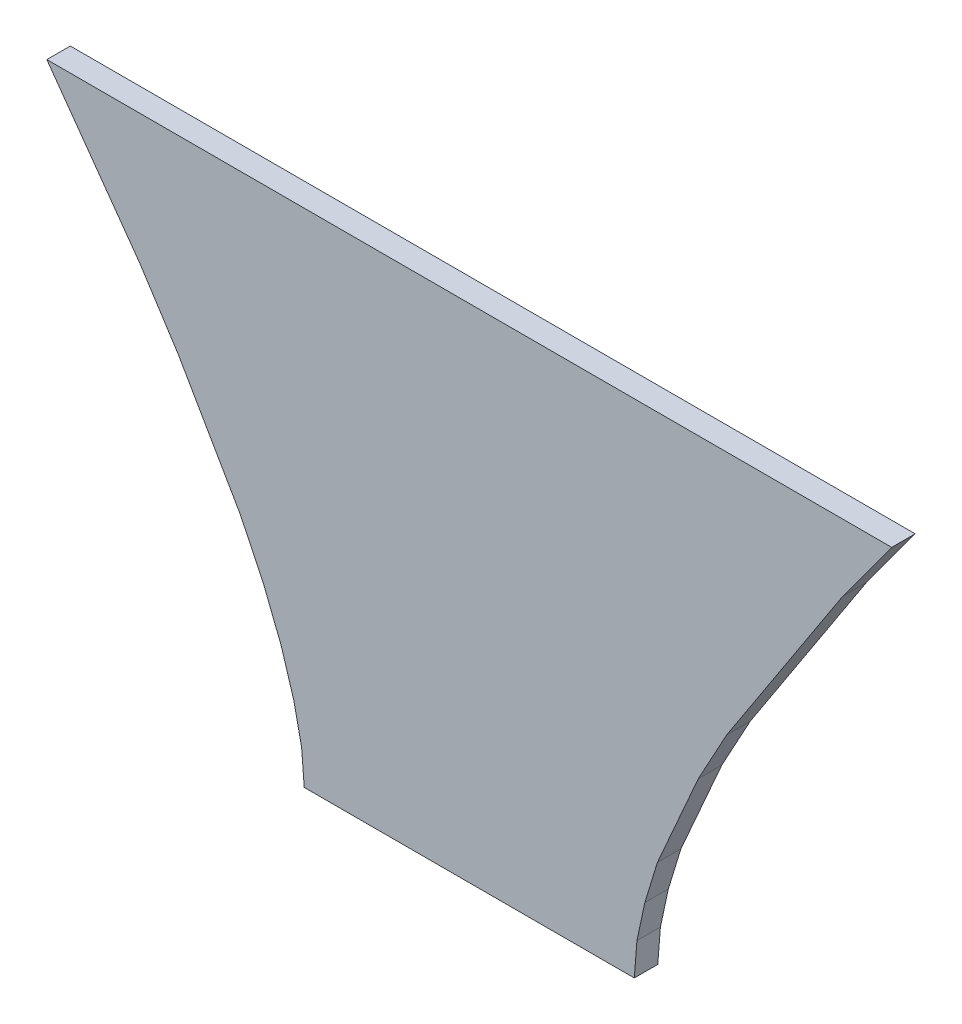
ISO-10303-21;
HEADER;
FILE_DESCRIPTION(('STEP AP214'),'2;1');
FILE_NAME('part.step','',(''),(''),'','','');
FILE_SCHEMA(('AUTOMOTIVE_DESIGN { 1 0 10303 214 1 1 1 1 }'));
ENDSEC;
DATA;
#1=APPLICATION_CONTEXT('core data for automotive mechanical design processes');
#2=APPLICATION_PROTOCOL_DEFINITION('international standard','automotive_design',2000,#1);
#3=PRODUCT_CONTEXT('',#1,'mechanical');
#4=PRODUCT('Part','Part','',(#3));
#5=PRODUCT_RELATED_PRODUCT_CATEGORY('part','',(#4));
#6=PRODUCT_DEFINITION_FORMATION('','',#4);
#7=PRODUCT_DEFINITION_CONTEXT('part definition',#1,'design');
#8=PRODUCT_DEFINITION('design','',#6,#7);
#9=PRODUCT_DEFINITION_SHAPE('','',#8);
#10=(LENGTH_UNIT() NAMED_UNIT(*) SI_UNIT(.MILLI.,.METRE.));
#11=(NAMED_UNIT(*) PLANE_ANGLE_UNIT() SI_UNIT($,.RADIAN.));
#12=(NAMED_UNIT(*) SI_UNIT($,.STERADIAN.) SOLID_ANGLE_UNIT());
#13=UNCERTAINTY_MEASURE_WITH_UNIT(LENGTH_MEASURE(1.E-05),#10,'distance_accuracy_value','');
#14=(GEOMETRIC_REPRESENTATION_CONTEXT(3) GLOBAL_UNCERTAINTY_ASSIGNED_CONTEXT((#13)) GLOBAL_UNIT_ASSIGNED_CONTEXT((#10,
#11,#12)) REPRESENTATION_CONTEXT('',''));
#15=CARTESIAN_POINT('',(0.,0.,0.));
#16=DIRECTION('',(0.,0.,1.));
#17=DIRECTION('',(1.,0.,0.));
#18=AXIS2_PLACEMENT_3D('',#15,#16,#17);
#19=CARTESIAN_POINT('',(44.3499984741211,57.3600006103516,0.));
#20=DIRECTION('',(-0.996935755737202,0.0782246695914672,0.));
#21=DIRECTION('',(0.0782246695914672,0.996935755737202,0.));
#22=AXIS2_PLACEMENT_3D('',#19,#20,#21);
#23=PLANE('',#22);
#24=DIRECTION('',(0.0782246695914672,0.996935755737202,0.));
#25=VECTOR('',#24,1.);
#26=CARTESIAN_POINT('',(44.3499984741211,57.3600006103516,0.03556));
#27=LINE('',#26,#25);
#28=CARTESIAN_POINT('',(44.3499984741211,57.3600006103516,0.03556));
#29=VERTEX_POINT('',#28);
#30=CARTESIAN_POINT('',(44.3540000915527,57.4109992980957,0.03556));
#31=VERTEX_POINT('',#30);
#32=EDGE_CURVE('E11',#29,#31,#27,.T.);
#33=ORIENTED_EDGE('',*,*,#32,.F.);
#34=DIRECTION('',(0.,0.,1.));
#35=VECTOR('',#34,1.);
#36=CARTESIAN_POINT('',(44.3499984741211,57.3600006103516,0.));
#37=LINE('',#36,#35);
#38=CARTESIAN_POINT('',(44.3499984741211,57.3600006103516,0.));
#39=VERTEX_POINT('',#38);
#40=EDGE_CURVE('E24',#39,#29,#37,.T.);
#41=ORIENTED_EDGE('',*,*,#40,.F.);
#42=DIRECTION('',(0.0782246695914672,0.996935755737202,0.));
#43=VECTOR('',#42,1.);
#44=CARTESIAN_POINT('',(44.3499984741211,57.3600006103516,0.));
#45=LINE('',#44,#43);
#46=CARTESIAN_POINT('',(44.3540000915527,57.4109992980957,0.));
#47=VERTEX_POINT('',#46);
#48=EDGE_CURVE('E154',#39,#47,#45,.T.);
#49=ORIENTED_EDGE('',*,*,#48,.T.);
#50=DIRECTION('',(0.,0.,1.));
#51=VECTOR('',#50,1.);
#52=CARTESIAN_POINT('',(44.3540000915527,57.4109992980957,0.));
#53=LINE('',#52,#51);
#54=EDGE_CURVE('E37',#47,#31,#53,.T.);
#55=ORIENTED_EDGE('',*,*,#54,.T.);
#56=EDGE_LOOP('',(#33,#41,#49,#55));
#57=FACE_BOUND('',#56,.T.);
#58=ADVANCED_FACE('F17',(#57),#23,.F.);
#59=CARTESIAN_POINT('',(44.3540000915527,57.4109992980957,0.));
#60=DIRECTION('',(-0.977798514930854,0.20954728392183,0.));
#61=DIRECTION('',(0.20954728392183,0.977798514930854,0.));
#62=AXIS2_PLACEMENT_3D('',#59,#60,#61);
#63=PLANE('',#62);
#64=DIRECTION('',(0.20954728392183,0.977798514930854,0.));
#65=VECTOR('',#64,1.);
#66=CARTESIAN_POINT('',(44.3540000915527,57.4109992980957,0.03556));
#67=LINE('',#66,#65);
#68=CARTESIAN_POINT('',(44.3660011291504,57.4669990539551,0.03556));
#69=VERTEX_POINT('',#68);
#70=EDGE_CURVE('E266',#31,#69,#67,.T.);
#71=ORIENTED_EDGE('',*,*,#70,.F.);
#72=ORIENTED_EDGE('',*,*,#54,.F.);
#73=DIRECTION('',(0.20954728392183,0.977798514930854,0.));
#74=VECTOR('',#73,1.);
#75=CARTESIAN_POINT('',(44.3540000915527,57.4109992980957,0.));
#76=LINE('',#75,#74);
#77=CARTESIAN_POINT('',(44.3660011291504,57.4669990539551,0.));
#78=VERTEX_POINT('',#77);
#79=EDGE_CURVE('E263',#47,#78,#76,.T.);
#80=ORIENTED_EDGE('',*,*,#79,.T.);
#81=DIRECTION('',(0.,0.,1.));
#82=VECTOR('',#81,1.);
#83=CARTESIAN_POINT('',(44.3660011291504,57.4669990539551,0.));
#84=LINE('',#83,#82);
#85=EDGE_CURVE('E261',#78,#69,#84,.T.);
#86=ORIENTED_EDGE('',*,*,#85,.T.);
#87=EDGE_LOOP('',(#71,#72,#80,#86));
#88=FACE_BOUND('',#87,.T.);
#89=ADVANCED_FACE('F274',(#88),#63,.F.);
#90=CARTESIAN_POINT('',(44.3660011291504,57.4669990539551,0.));
#91=DIRECTION('',(-0.956124316979851,0.292961243989396,0.));
#92=DIRECTION('',(0.292961243989396,0.956124316979851,0.));
#93=AXIS2_PLACEMENT_3D('',#90,#91,#92);
#94=PLANE('',#93);
#95=DIRECTION('',(0.292961243989396,0.956124316979851,0.));
#96=VECTOR('',#95,1.);
#97=CARTESIAN_POINT('',(44.3660011291504,57.4669990539551,0.03556));
#98=LINE('',#97,#96);
#99=CARTESIAN_POINT('',(44.3849983215332,57.5289993286133,0.03556));
#100=VERTEX_POINT('',#99);
#101=EDGE_CURVE('E258',#69,#100,#98,.T.);
#102=ORIENTED_EDGE('',*,*,#101,.F.);
#103=ORIENTED_EDGE('',*,*,#85,.F.);
#104=DIRECTION('',(0.292961243989396,0.956124316979851,0.));
#105=VECTOR('',#104,1.);
#106=CARTESIAN_POINT('',(44.3660011291504,57.4669990539551,0.));
#107=LINE('',#106,#105);
#108=CARTESIAN_POINT('',(44.3849983215332,57.5289993286133,0.));
#109=VERTEX_POINT('',#108);
#110=EDGE_CURVE('E255',#78,#109,#107,.T.);
#111=ORIENTED_EDGE('',*,*,#110,.T.);
#112=DIRECTION('',(0.,0.,1.));
#113=VECTOR('',#112,1.);
#114=CARTESIAN_POINT('',(44.3849983215332,57.5289993286133,0.));
#115=LINE('',#114,#113);
#116=EDGE_CURVE('E253',#109,#100,#115,.T.);
#117=ORIENTED_EDGE('',*,*,#116,.T.);
#118=EDGE_LOOP('',(#102,#103,#111,#117));
#119=FACE_BOUND('',#118,.T.);
#120=ADVANCED_FACE('F280',(#119),#94,.F.);
#121=CARTESIAN_POINT('',(44.3849983215332,57.5289993286133,0.));
#122=DIRECTION('',(-0.915408860238773,0.402525301808906,0.));
#123=DIRECTION('',(0.402525301808906,0.915408860238773,0.));
#124=AXIS2_PLACEMENT_3D('',#121,#122,#123);
#125=PLANE('',#124);
#126=DIRECTION('',(0.402525301808906,0.915408860238773,0.));
#127=VECTOR('',#126,1.);
#128=CARTESIAN_POINT('',(44.3849983215332,57.5289993286133,0.03556));
#129=LINE('',#128,#127);
#130=CARTESIAN_POINT('',(44.4469985961914,57.6699981689453,0.03556));
#131=VERTEX_POINT('',#130);
#132=EDGE_CURVE('E250',#100,#131,#129,.T.);
#133=ORIENTED_EDGE('',*,*,#132,.F.);
#134=ORIENTED_EDGE('',*,*,#116,.F.);
#135=DIRECTION('',(0.402525301808906,0.915408860238773,0.));
#136=VECTOR('',#135,1.);
#137=CARTESIAN_POINT('',(44.3849983215332,57.5289993286133,0.));
#138=LINE('',#137,#136);
#139=CARTESIAN_POINT('',(44.4469985961914,57.6699981689453,0.));
#140=VERTEX_POINT('',#139);
#141=EDGE_CURVE('E247',#109,#140,#138,.T.);
#142=ORIENTED_EDGE('',*,*,#141,.T.);
#143=DIRECTION('',(0.,0.,1.));
#144=VECTOR('',#143,1.);
#145=CARTESIAN_POINT('',(44.4469985961914,57.6699981689453,0.));
#146=LINE('',#145,#144);
#147=EDGE_CURVE('E245',#140,#131,#146,.T.);
#148=ORIENTED_EDGE('',*,*,#147,.T.);
#149=EDGE_LOOP('',(#133,#134,#142,#148));
#150=FACE_BOUND('',#149,.T.);
#151=ADVANCED_FACE('F282',(#150),#125,.F.);
#152=CARTESIAN_POINT('',(44.4469985961914,57.6699981689453,0.));
#153=DIRECTION('',(-0.878311777532208,0.478088298798676,0.));
#154=DIRECTION('',(0.478088298798676,0.878311777532208,0.));
#155=AXIS2_PLACEMENT_3D('',#152,#153,#154);
#156=PLANE('',#155);
#157=DIRECTION('',(0.478088298798676,0.878311777532208,0.));
#158=VECTOR('',#157,1.);
#159=CARTESIAN_POINT('',(44.4469985961914,57.6699981689453,0.03556));
#160=LINE('',#159,#158);
#161=CARTESIAN_POINT('',(44.4900016784668,57.7490005493164,0.03556));
#162=VERTEX_POINT('',#161);
#163=EDGE_CURVE('E242',#131,#162,#160,.T.);
#164=ORIENTED_EDGE('',*,*,#163,.F.);
#165=ORIENTED_EDGE('',*,*,#147,.F.);
#166=DIRECTION('',(0.478088298798676,0.878311777532208,0.));
#167=VECTOR('',#166,1.);
#168=CARTESIAN_POINT('',(44.4469985961914,57.6699981689453,0.));
#169=LINE('',#168,#167);
#170=CARTESIAN_POINT('',(44.4900016784668,57.7490005493164,0.));
#171=VERTEX_POINT('',#170);
#172=EDGE_CURVE('E239',#140,#171,#169,.T.);
#173=ORIENTED_EDGE('',*,*,#172,.T.);
#174=DIRECTION('',(0.,0.,1.));
#175=VECTOR('',#174,1.);
#176=CARTESIAN_POINT('',(44.4900016784668,57.7490005493164,0.));
#177=LINE('',#176,#175);
#178=EDGE_CURVE('E237',#171,#162,#177,.T.);
#179=ORIENTED_EDGE('',*,*,#178,.T.);
#180=EDGE_LOOP('',(#164,#165,#173,#179));
#181=FACE_BOUND('',#180,.T.);
#182=ADVANCED_FACE('F287',(#181),#156,.F.);
#183=CARTESIAN_POINT('',(44.4900016784668,57.7490005493164,0.));
#184=DIRECTION('',(-0.837736311937865,0.546074968901472,0.));
#185=DIRECTION('',(0.546074968901472,0.837736311937865,0.));
#186=AXIS2_PLACEMENT_3D('',#183,#184,#185);
#187=PLANE('',#186);
#188=DIRECTION('',(0.546074968901472,0.837736311937865,0.));
#189=VECTOR('',#188,1.);
#190=CARTESIAN_POINT('',(44.4900016784668,57.7490005493164,0.03556));
#191=LINE('',#190,#189);
#192=CARTESIAN_POINT('',(44.6660003662109,58.0190010070801,0.03556));
#193=VERTEX_POINT('',#192);
#194=EDGE_CURVE('E234',#162,#193,#191,.T.);
#195=ORIENTED_EDGE('',*,*,#194,.F.);
#196=ORIENTED_EDGE('',*,*,#178,.F.);
#197=DIRECTION('',(0.546074968901472,0.837736311937865,0.));
#198=VECTOR('',#197,1.);
#199=CARTESIAN_POINT('',(44.4900016784668,57.7490005493164,0.));
#200=LINE('',#199,#198);
#201=CARTESIAN_POINT('',(44.6660003662109,58.0190010070801,0.));
#202=VERTEX_POINT('',#201);
#203=EDGE_CURVE('E231',#171,#202,#200,.T.);
#204=ORIENTED_EDGE('',*,*,#203,.T.);
#205=DIRECTION('',(0.,0.,1.));
#206=VECTOR('',#205,1.);
#207=CARTESIAN_POINT('',(44.6660003662109,58.0190010070801,0.));
#208=LINE('',#207,#206);
#209=EDGE_CURVE('E229',#202,#193,#208,.T.);
#210=ORIENTED_EDGE('',*,*,#209,.T.);
#211=EDGE_LOOP('',(#195,#196,#204,#210));
#212=FACE_BOUND('',#211,.T.);
#213=ADVANCED_FACE('F290',(#212),#187,.F.);
#214=CARTESIAN_POINT('',(44.6660003662109,58.0190010070801,0.));
#215=DIRECTION('',(-0.806648048454726,0.591032085359316,0.));
#216=DIRECTION('',(0.591032085359316,0.806648048454726,0.));
#217=AXIS2_PLACEMENT_3D('',#214,#215,#216);
#218=PLANE('',#217);
#219=DIRECTION('',(0.591032085359316,0.806648048454726,0.));
#220=VECTOR('',#219,1.);
#221=CARTESIAN_POINT('',(44.6660003662109,58.0190010070801,0.03556));
#222=LINE('',#221,#220);
#223=CARTESIAN_POINT('',(44.7400016784668,58.1199989318848,0.03556));
#224=VERTEX_POINT('',#223);
#225=EDGE_CURVE('E226',#193,#224,#222,.T.);
#226=ORIENTED_EDGE('',*,*,#225,.F.);
#227=ORIENTED_EDGE('',*,*,#209,.F.);
#228=DIRECTION('',(0.591032085359316,0.806648048454726,0.));
#229=VECTOR('',#228,1.);
#230=CARTESIAN_POINT('',(44.6660003662109,58.0190010070801,0.));
#231=LINE('',#230,#229);
#232=CARTESIAN_POINT('',(44.7400016784668,58.1199989318848,0.));
#233=VERTEX_POINT('',#232);
#234=EDGE_CURVE('E223',#202,#233,#231,.T.);
#235=ORIENTED_EDGE('',*,*,#234,.T.);
#236=DIRECTION('',(0.,0.,1.));
#237=VECTOR('',#236,1.);
#238=CARTESIAN_POINT('',(44.7400016784668,58.1199989318848,0.));
#239=LINE('',#238,#237);
#240=EDGE_CURVE('E221',#233,#224,#239,.T.);
#241=ORIENTED_EDGE('',*,*,#240,.T.);
#242=EDGE_LOOP('',(#226,#227,#235,#241));
#243=FACE_BOUND('',#242,.T.);
#244=ADVANCED_FACE('F295',(#243),#218,.F.);
#245=CARTESIAN_POINT('',(44.7400016784668,58.1199989318848,0.));
#246=DIRECTION('',(0.,-1.,0.));
#247=DIRECTION('',(-1.,0.,0.));
#248=AXIS2_PLACEMENT_3D('',#245,#246,#247);
#249=PLANE('',#248);
#250=DIRECTION('',(-1.,0.,0.));
#251=VECTOR('',#250,1.);
#252=CARTESIAN_POINT('',(44.7400016784668,58.1199989318848,0.03556));
#253=LINE('',#252,#251);
#254=CARTESIAN_POINT('',(43.4599990844727,58.1199989318848,0.03556));
#255=VERTEX_POINT('',#254);
#256=EDGE_CURVE('E218',#224,#255,#253,.T.);
#257=ORIENTED_EDGE('',*,*,#256,.F.);
#258=ORIENTED_EDGE('',*,*,#240,.F.);
#259=DIRECTION('',(-1.,0.,0.));
#260=VECTOR('',#259,1.);
#261=CARTESIAN_POINT('',(44.7400016784668,58.1199989318848,0.));
#262=LINE('',#261,#260);
#263=CARTESIAN_POINT('',(43.4599990844727,58.1199989318848,0.));
#264=VERTEX_POINT('',#263);
#265=EDGE_CURVE('E215',#233,#264,#262,.T.);
#266=ORIENTED_EDGE('',*,*,#265,.T.);
#267=DIRECTION('',(0.,0.,1.));
#268=VECTOR('',#267,1.);
#269=CARTESIAN_POINT('',(43.4599990844727,58.1199989318848,0.));
#270=LINE('',#269,#268);
#271=EDGE_CURVE('E213',#264,#255,#270,.T.);
#272=ORIENTED_EDGE('',*,*,#271,.T.);
#273=EDGE_LOOP('',(#257,#258,#266,#272));
#274=FACE_BOUND('',#273,.T.);
#275=ADVANCED_FACE('F298',(#274),#249,.F.);
#276=CARTESIAN_POINT('',(43.4599990844727,58.1199989318848,0.));
#277=DIRECTION('',(0.813168136703764,0.582028849327702,0.));
#278=DIRECTION('',(0.582028849327702,-0.813168136703764,0.));
#279=AXIS2_PLACEMENT_3D('',#276,#277,#278);
#280=PLANE('',#279);
#281=DIRECTION('',(0.582028849327702,-0.813168136703763,0.));
#282=VECTOR('',#281,1.);
#283=CARTESIAN_POINT('',(43.4599990844727,58.1199989318848,0.03556));
#284=LINE('',#283,#282);
#285=CARTESIAN_POINT('',(43.601001739502,57.9230003356934,0.03556));
#286=VERTEX_POINT('',#285);
#287=EDGE_CURVE('E210',#255,#286,#284,.T.);
#288=ORIENTED_EDGE('',*,*,#287,.F.);
#289=ORIENTED_EDGE('',*,*,#271,.F.);
#290=DIRECTION('',(0.582028849327702,-0.813168136703763,0.));
#291=VECTOR('',#290,1.);
#292=CARTESIAN_POINT('',(43.4599990844727,58.1199989318848,0.));
#293=LINE('',#292,#291);
#294=CARTESIAN_POINT('',(43.601001739502,57.9230003356934,0.));
#295=VERTEX_POINT('',#294);
#296=EDGE_CURVE('E207',#264,#295,#293,.T.);
#297=ORIENTED_EDGE('',*,*,#296,.T.);
#298=DIRECTION('',(0.,0.,1.));
#299=VECTOR('',#298,1.);
#300=CARTESIAN_POINT('',(43.601001739502,57.9230003356934,0.));
#301=LINE('',#300,#299);
#302=EDGE_CURVE('E205',#295,#286,#301,.T.);
#303=ORIENTED_EDGE('',*,*,#302,.T.);
#304=EDGE_LOOP('',(#288,#289,#297,#303));
#305=FACE_BOUND('',#304,.T.);
#306=ADVANCED_FACE('F303',(#305),#280,.F.);
#307=CARTESIAN_POINT('',(43.601001739502,57.9230003356934,0.));
#308=DIRECTION('',(0.840577163694531,0.541691823710916,0.));
#309=DIRECTION('',(0.541691823710916,-0.840577163694531,0.));
#310=AXIS2_PLACEMENT_3D('',#307,#308,#309);
#311=PLANE('',#310);
#312=DIRECTION('',(0.541691823710916,-0.840577163694531,0.));
#313=VECTOR('',#312,1.);
#314=CARTESIAN_POINT('',(43.601001739502,57.9230003356934,0.03556));
#315=LINE('',#314,#313);
#316=CARTESIAN_POINT('',(43.6590003967285,57.8330001831055,0.03556));
#317=VERTEX_POINT('',#316);
#318=EDGE_CURVE('E202',#286,#317,#315,.T.);
#319=ORIENTED_EDGE('',*,*,#318,.F.);
#320=ORIENTED_EDGE('',*,*,#302,.F.);
#321=DIRECTION('',(0.541691823710916,-0.840577163694531,0.));
#322=VECTOR('',#321,1.);
#323=CARTESIAN_POINT('',(43.601001739502,57.9230003356934,0.));
#324=LINE('',#323,#322);
#325=CARTESIAN_POINT('',(43.6590003967285,57.8330001831055,0.));
#326=VERTEX_POINT('',#325);
#327=EDGE_CURVE('E199',#295,#326,#324,.T.);
#328=ORIENTED_EDGE('',*,*,#327,.T.);
#329=DIRECTION('',(0.,0.,1.));
#330=VECTOR('',#329,1.);
#331=CARTESIAN_POINT('',(43.6590003967285,57.8330001831055,0.));
#332=LINE('',#331,#330);
#333=EDGE_CURVE('E197',#326,#317,#332,.T.);
#334=ORIENTED_EDGE('',*,*,#333,.T.);
#335=EDGE_LOOP('',(#319,#320,#328,#334));
#336=FACE_BOUND('',#335,.T.);
#337=ADVANCED_FACE('F306',(#336),#311,.F.);
#338=CARTESIAN_POINT('',(43.6590003967285,57.8330001831055,0.));
#339=DIRECTION('',(0.866281424263155,0.499556297104339,0.));
#340=DIRECTION('',(0.499556297104339,-0.866281424263155,0.));
#341=AXIS2_PLACEMENT_3D('',#338,#339,#340);
#342=PLANE('',#341);
#343=DIRECTION('',(0.499556297104339,-0.866281424263155,0.));
#344=VECTOR('',#343,1.);
#345=CARTESIAN_POINT('',(43.6590003967285,57.8330001831055,0.03556));
#346=LINE('',#345,#344);
#347=CARTESIAN_POINT('',(43.7529983520508,57.6699981689453,0.03556));
#348=VERTEX_POINT('',#347);
#349=EDGE_CURVE('E194',#317,#348,#346,.T.);
#350=ORIENTED_EDGE('',*,*,#349,.F.);
#351=ORIENTED_EDGE('',*,*,#333,.F.);
#352=DIRECTION('',(0.499556297104339,-0.866281424263155,0.));
#353=VECTOR('',#352,1.);
#354=CARTESIAN_POINT('',(43.6590003967285,57.8330001831055,0.));
#355=LINE('',#354,#353);
#356=CARTESIAN_POINT('',(43.7529983520508,57.6699981689453,0.));
#357=VERTEX_POINT('',#356);
#358=EDGE_CURVE('E191',#326,#357,#355,.T.);
#359=ORIENTED_EDGE('',*,*,#358,.T.);
#360=DIRECTION('',(0.,0.,1.));
#361=VECTOR('',#360,1.);
#362=CARTESIAN_POINT('',(43.7529983520508,57.6699981689453,0.));
#363=LINE('',#362,#361);
#364=EDGE_CURVE('E189',#357,#348,#363,.T.);
#365=ORIENTED_EDGE('',*,*,#364,.T.);
#366=EDGE_LOOP('',(#350,#351,#359,#365));
#367=FACE_BOUND('',#366,.T.);
#368=ADVANCED_FACE('F311',(#367),#342,.F.);
#369=CARTESIAN_POINT('',(43.7529983520508,57.6699981689453,0.));
#370=DIRECTION('',(0.901711946650169,0.432337328099671,0.));
#371=DIRECTION('',(0.432337328099671,-0.901711946650169,0.));
#372=AXIS2_PLACEMENT_3D('',#369,#370,#371);
#373=PLANE('',#372);
#374=DIRECTION('',(0.432337328099671,-0.901711946650169,0.));
#375=VECTOR('',#374,1.);
#376=CARTESIAN_POINT('',(43.7529983520508,57.6699981689453,0.03556));
#377=LINE('',#376,#375);
#378=CARTESIAN_POINT('',(43.7879981994629,57.5970001220703,0.03556));
#379=VERTEX_POINT('',#378);
#380=EDGE_CURVE('E186',#348,#379,#377,.T.);
#381=ORIENTED_EDGE('',*,*,#380,.F.);
#382=ORIENTED_EDGE('',*,*,#364,.F.);
#383=DIRECTION('',(0.432337328099671,-0.901711946650169,0.));
#384=VECTOR('',#383,1.);
#385=CARTESIAN_POINT('',(43.7529983520508,57.6699981689453,0.));
#386=LINE('',#385,#384);
#387=CARTESIAN_POINT('',(43.7879981994629,57.5970001220703,0.));
#388=VERTEX_POINT('',#387);
#389=EDGE_CURVE('E183',#357,#388,#386,.T.);
#390=ORIENTED_EDGE('',*,*,#389,.T.);
#391=DIRECTION('',(0.,0.,1.));
#392=VECTOR('',#391,1.);
#393=CARTESIAN_POINT('',(43.7879981994629,57.5970001220703,0.));
#394=LINE('',#393,#392);
#395=EDGE_CURVE('E181',#388,#379,#394,.T.);
#396=ORIENTED_EDGE('',*,*,#395,.T.);
#397=EDGE_LOOP('',(#381,#382,#390,#396));
#398=FACE_BOUND('',#397,.T.);
#399=ADVANCED_FACE('F314',(#398),#373,.F.);
#400=CARTESIAN_POINT('',(43.7879981994629,57.5970001220703,0.));
#401=DIRECTION('',(0.929415787299834,0.369034272551791,0.));
#402=DIRECTION('',(0.369034272551791,-0.929415787299834,0.));
#403=AXIS2_PLACEMENT_3D('',#400,#401,#402);
#404=PLANE('',#403);
#405=DIRECTION('',(0.369034272551791,-0.929415787299834,0.));
#406=VECTOR('',#405,1.);
#407=CARTESIAN_POINT('',(43.7879981994629,57.5970001220703,0.03556));
#408=LINE('',#407,#406);
#409=CARTESIAN_POINT('',(43.814998626709,57.5289993286133,0.03556));
#410=VERTEX_POINT('',#409);
#411=EDGE_CURVE('E178',#379,#410,#408,.T.);
#412=ORIENTED_EDGE('',*,*,#411,.F.);
#413=ORIENTED_EDGE('',*,*,#395,.F.);
#414=DIRECTION('',(0.369034272551791,-0.929415787299834,0.));
#415=VECTOR('',#414,1.);
#416=CARTESIAN_POINT('',(43.7879981994629,57.5970001220703,0.));
#417=LINE('',#416,#415);
#418=CARTESIAN_POINT('',(43.814998626709,57.5289993286133,0.));
#419=VERTEX_POINT('',#418);
#420=EDGE_CURVE('E175',#388,#419,#417,.T.);
#421=ORIENTED_EDGE('',*,*,#420,.T.);
#422=DIRECTION('',(0.,0.,1.));
#423=VECTOR('',#422,1.);
#424=CARTESIAN_POINT('',(43.814998626709,57.5289993286133,0.));
#425=LINE('',#424,#423);
#426=EDGE_CURVE('E173',#419,#410,#425,.T.);
#427=ORIENTED_EDGE('',*,*,#426,.T.);
#428=EDGE_LOOP('',(#412,#413,#421,#427));
#429=FACE_BOUND('',#428,.T.);
#430=ADVANCED_FACE('F319',(#429),#404,.F.);
#431=CARTESIAN_POINT('',(43.814998626709,57.5289993286133,0.));
#432=DIRECTION('',(0.956107837718677,0.293015021206961,0.));
#433=DIRECTION('',(0.293015021206961,-0.956107837718677,0.));
#434=AXIS2_PLACEMENT_3D('',#431,#432,#433);
#435=PLANE('',#434);
#436=DIRECTION('',(0.293015021206961,-0.956107837718677,0.));
#437=VECTOR('',#436,1.);
#438=CARTESIAN_POINT('',(43.814998626709,57.5289993286133,0.03556));
#439=LINE('',#438,#437);
#440=CARTESIAN_POINT('',(43.8339996337891,57.4669990539551,0.03556));
#441=VERTEX_POINT('',#440);
#442=EDGE_CURVE('E170',#410,#441,#439,.T.);
#443=ORIENTED_EDGE('',*,*,#442,.F.);
#444=ORIENTED_EDGE('',*,*,#426,.F.);
#445=DIRECTION('',(0.293015021206961,-0.956107837718677,0.));
#446=VECTOR('',#445,1.);
#447=CARTESIAN_POINT('',(43.814998626709,57.5289993286133,0.));
#448=LINE('',#447,#446);
#449=CARTESIAN_POINT('',(43.8339996337891,57.4669990539551,0.));
#450=VERTEX_POINT('',#449);
#451=EDGE_CURVE('E167',#419,#450,#448,.T.);
#452=ORIENTED_EDGE('',*,*,#451,.T.);
#453=DIRECTION('',(0.,0.,1.));
#454=VECTOR('',#453,1.);
#455=CARTESIAN_POINT('',(43.8339996337891,57.4669990539551,0.));
#456=LINE('',#455,#454);
#457=EDGE_CURVE('E165',#450,#441,#456,.T.);
#458=ORIENTED_EDGE('',*,*,#457,.T.);
#459=EDGE_LOOP('',(#443,#444,#452,#458));
#460=FACE_BOUND('',#459,.T.);
#461=ADVANCED_FACE('F322',(#460),#435,.F.);
#462=CARTESIAN_POINT('',(43.8339996337891,57.4669990539551,0.));
#463=DIRECTION('',(0.977798514930854,0.20954728392183,0.));
#464=DIRECTION('',(0.20954728392183,-0.977798514930854,0.));
#465=AXIS2_PLACEMENT_3D('',#462,#463,#464);
#466=PLANE('',#465);
#467=DIRECTION('',(0.20954728392183,-0.977798514930854,0.));
#468=VECTOR('',#467,1.);
#469=CARTESIAN_POINT('',(43.8339996337891,57.4669990539551,0.03556));
#470=LINE('',#469,#468);
#471=CARTESIAN_POINT('',(43.8460006713867,57.4109992980957,0.03556));
#472=VERTEX_POINT('',#471);
#473=EDGE_CURVE('E162',#441,#472,#470,.T.);
#474=ORIENTED_EDGE('',*,*,#473,.F.);
#475=ORIENTED_EDGE('',*,*,#457,.F.);
#476=DIRECTION('',(0.20954728392183,-0.977798514930854,0.));
#477=VECTOR('',#476,1.);
#478=CARTESIAN_POINT('',(43.8339996337891,57.4669990539551,0.));
#479=LINE('',#478,#477);
#480=CARTESIAN_POINT('',(43.8460006713867,57.4109992980957,0.));
#481=VERTEX_POINT('',#480);
#482=EDGE_CURVE('E160',#450,#481,#479,.T.);
#483=ORIENTED_EDGE('',*,*,#482,.T.);
#484=DIRECTION('',(0.,0.,1.));
#485=VECTOR('',#484,1.);
#486=CARTESIAN_POINT('',(43.8460006713867,57.4109992980957,0.));
#487=LINE('',#486,#485);
#488=EDGE_CURVE('E145',#481,#472,#487,.T.);
#489=ORIENTED_EDGE('',*,*,#488,.T.);
#490=EDGE_LOOP('',(#474,#475,#483,#489));
#491=FACE_BOUND('',#490,.T.);
#492=ADVANCED_FACE('F325',(#491),#466,.F.);
#493=CARTESIAN_POINT('',(43.8460006713867,57.4109992980957,0.));
#494=DIRECTION('',(0.996941568410366,0.0781505545436505,0.));
#495=DIRECTION('',(0.0781505545436505,-0.996941568410366,0.));
#496=AXIS2_PLACEMENT_3D('',#493,#494,#495);
#497=PLANE('',#496);
#498=DIRECTION('',(0.0781505545436505,-0.996941568410366,0.));
#499=VECTOR('',#498,1.);
#500=CARTESIAN_POINT('',(43.8460006713867,57.4109992980957,0.03556));
#501=LINE('',#500,#499);
#502=CARTESIAN_POINT('',(43.8499984741211,57.3600006103516,0.03556));
#503=VERTEX_POINT('',#502);
#504=EDGE_CURVE('E149',#472,#503,#501,.T.);
#505=ORIENTED_EDGE('',*,*,#504,.F.);
#506=ORIENTED_EDGE('',*,*,#488,.F.);
#507=DIRECTION('',(0.0781505545436505,-0.996941568410366,0.));
#508=VECTOR('',#507,1.);
#509=CARTESIAN_POINT('',(43.8460006713867,57.4109992980957,0.));
#510=LINE('',#509,#508);
#511=CARTESIAN_POINT('',(43.8499984741211,57.3600006103516,0.));
#512=VERTEX_POINT('',#511);
#513=EDGE_CURVE('E141',#481,#512,#510,.T.);
#514=ORIENTED_EDGE('',*,*,#513,.T.);
#515=DIRECTION('',(0.,0.,1.));
#516=VECTOR('',#515,1.);
#517=CARTESIAN_POINT('',(43.8499984741211,57.3600006103516,0.));
#518=LINE('',#517,#516);
#519=EDGE_CURVE('E131',#512,#503,#518,.T.);
#520=ORIENTED_EDGE('',*,*,#519,.T.);
#521=EDGE_LOOP('',(#505,#506,#514,#520));
#522=FACE_BOUND('',#521,.T.);
#523=ADVANCED_FACE('F144',(#522),#497,.F.);
#524=CARTESIAN_POINT('',(43.8499984741211,57.3600006103516,0.));
#525=DIRECTION('',(0.,1.,0.));
#526=DIRECTION('',(1.,0.,0.));
#527=AXIS2_PLACEMENT_3D('',#524,#525,#526);
#528=PLANE('',#527);
#529=DIRECTION('',(1.,0.,0.));
#530=VECTOR('',#529,1.);
#531=CARTESIAN_POINT('',(43.8499984741211,57.3600006103516,0.03556));
#532=LINE('',#531,#530);
#533=EDGE_CURVE('E137',#503,#29,#532,.T.);
#534=ORIENTED_EDGE('',*,*,#533,.F.);
#535=ORIENTED_EDGE('',*,*,#519,.F.);
#536=DIRECTION('',(1.,0.,0.));
#537=VECTOR('',#536,1.);
#538=CARTESIAN_POINT('',(43.8499984741211,57.3600006103516,0.));
#539=LINE('',#538,#537);
#540=EDGE_CURVE('E135',#512,#39,#539,.T.);
#541=ORIENTED_EDGE('',*,*,#540,.T.);
#542=ORIENTED_EDGE('',*,*,#40,.T.);
#543=EDGE_LOOP('',(#534,#535,#541,#542));
#544=FACE_BOUND('',#543,.T.);
#545=ADVANCED_FACE('F133',(#544),#528,.F.);
#546=CARTESIAN_POINT('',(44.3499984741211,57.3600006103516,0.));
#547=DIRECTION('',(0.,0.,1.));
#548=DIRECTION('',(1.,0.,0.));
#549=AXIS2_PLACEMENT_3D('',#546,#547,#548);
#550=PLANE('',#549);
#551=ORIENTED_EDGE('',*,*,#540,.F.);
#552=ORIENTED_EDGE('',*,*,#513,.F.);
#553=ORIENTED_EDGE('',*,*,#482,.F.);
#554=ORIENTED_EDGE('',*,*,#451,.F.);
#555=ORIENTED_EDGE('',*,*,#420,.F.);
#556=ORIENTED_EDGE('',*,*,#389,.F.);
#557=ORIENTED_EDGE('',*,*,#358,.F.);
#558=ORIENTED_EDGE('',*,*,#327,.F.);
#559=ORIENTED_EDGE('',*,*,#296,.F.);
#560=ORIENTED_EDGE('',*,*,#265,.F.);
#561=ORIENTED_EDGE('',*,*,#234,.F.);
#562=ORIENTED_EDGE('',*,*,#203,.F.);
#563=ORIENTED_EDGE('',*,*,#172,.F.);
#564=ORIENTED_EDGE('',*,*,#141,.F.);
#565=ORIENTED_EDGE('',*,*,#110,.F.);
#566=ORIENTED_EDGE('',*,*,#79,.F.);
#567=ORIENTED_EDGE('',*,*,#48,.F.);
#568=EDGE_LOOP('',(#551,#552,#553,#554,#555,#556,#557,#558,#559,#560,#561,#562,#563,#564,#565,
#566,#567));
#569=FACE_BOUND('',#568,.T.);
#570=ADVANCED_FACE('F152',(#569),#550,.F.);
#571=CARTESIAN_POINT('',(44.3499984741211,57.3600006103516,0.03556));
#572=DIRECTION('',(0.,0.,1.));
#573=DIRECTION('',(1.,0.,0.));
#574=AXIS2_PLACEMENT_3D('',#571,#572,#573);
#575=PLANE('',#574);
#576=ORIENTED_EDGE('',*,*,#32,.T.);
#577=ORIENTED_EDGE('',*,*,#70,.T.);
#578=ORIENTED_EDGE('',*,*,#101,.T.);
#579=ORIENTED_EDGE('',*,*,#132,.T.);
#580=ORIENTED_EDGE('',*,*,#163,.T.);
#581=ORIENTED_EDGE('',*,*,#194,.T.);
#582=ORIENTED_EDGE('',*,*,#225,.T.);
#583=ORIENTED_EDGE('',*,*,#256,.T.);
#584=ORIENTED_EDGE('',*,*,#287,.T.);
#585=ORIENTED_EDGE('',*,*,#318,.T.);
#586=ORIENTED_EDGE('',*,*,#349,.T.);
#587=ORIENTED_EDGE('',*,*,#380,.T.);
#588=ORIENTED_EDGE('',*,*,#411,.T.);
#589=ORIENTED_EDGE('',*,*,#442,.T.);
#590=ORIENTED_EDGE('',*,*,#473,.T.);
#591=ORIENTED_EDGE('',*,*,#504,.T.);
#592=ORIENTED_EDGE('',*,*,#533,.T.);
#593=EDGE_LOOP('',(#576,#577,#578,#579,#580,#581,#582,#583,#584,#585,#586,#587,#588,#589,#590,
#591,#592));
#594=FACE_BOUND('',#593,.T.);
#595=ADVANCED_FACE('F277',(#594),#575,.T.);
#596=CLOSED_SHELL('',(#58,#89,#120,#151,#182,#213,#244,#275,#306,#337,#368,#399,#430,#461,#492,
#523,#545,#570,#595));
#597=MANIFOLD_SOLID_BREP('B1',#596);
#598=ADVANCED_BREP_SHAPE_REPRESENTATION('',(#18,#597),#14);
#599=SHAPE_DEFINITION_REPRESENTATION(#9,#598);
ENDSEC;
END-ISO-10303-21;
